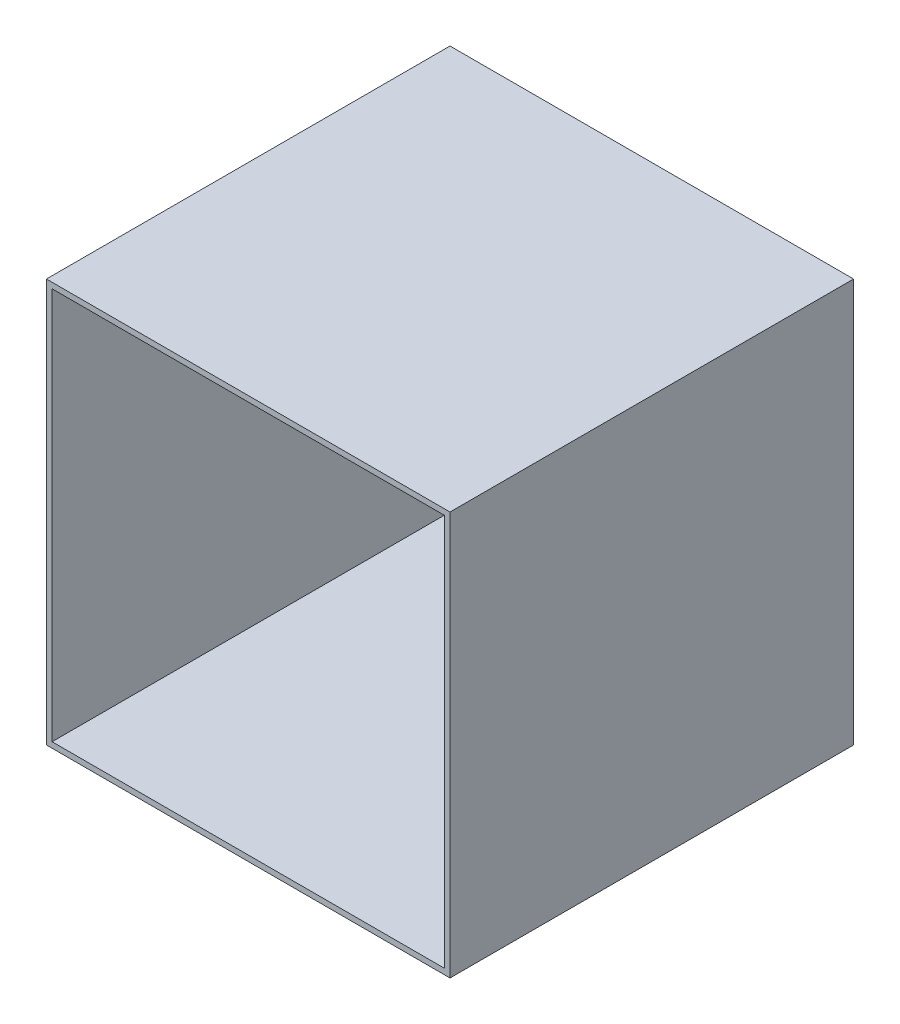
ISO-10303-21;
HEADER;
FILE_DESCRIPTION(('STEP AP214'),'2;1');
FILE_NAME('part.step','',(''),(''),'','','');
FILE_SCHEMA(('AUTOMOTIVE_DESIGN { 1 0 10303 214 1 1 1 1 }'));
ENDSEC;
DATA;
#1=APPLICATION_CONTEXT('core data for automotive mechanical design processes');
#2=APPLICATION_PROTOCOL_DEFINITION('international standard','automotive_design',2000,#1);
#3=PRODUCT_CONTEXT('',#1,'mechanical');
#4=PRODUCT('Part','Part','',(#3));
#5=PRODUCT_RELATED_PRODUCT_CATEGORY('part','',(#4));
#6=PRODUCT_DEFINITION_FORMATION('','',#4);
#7=PRODUCT_DEFINITION_CONTEXT('part definition',#1,'design');
#8=PRODUCT_DEFINITION('design','',#6,#7);
#9=PRODUCT_DEFINITION_SHAPE('','',#8);
#10=(LENGTH_UNIT() NAMED_UNIT(*) SI_UNIT(.MILLI.,.METRE.));
#11=(NAMED_UNIT(*) PLANE_ANGLE_UNIT() SI_UNIT($,.RADIAN.));
#12=(NAMED_UNIT(*) SI_UNIT($,.STERADIAN.) SOLID_ANGLE_UNIT());
#13=UNCERTAINTY_MEASURE_WITH_UNIT(LENGTH_MEASURE(1.E-05),#10,'distance_accuracy_value','');
#14=(GEOMETRIC_REPRESENTATION_CONTEXT(3) GLOBAL_UNCERTAINTY_ASSIGNED_CONTEXT((#13)) GLOBAL_UNIT_ASSIGNED_CONTEXT((#10,
#11,#12)) REPRESENTATION_CONTEXT('',''));
#15=CARTESIAN_POINT('',(0.,0.,0.));
#16=DIRECTION('',(0.,0.,1.));
#17=DIRECTION('',(1.,0.,0.));
#18=AXIS2_PLACEMENT_3D('',#15,#16,#17);
#19=CARTESIAN_POINT('',(0.,0.,25.));
#20=DIRECTION('',(0.,0.,1.));
#21=DIRECTION('',(1.,0.,0.));
#22=AXIS2_PLACEMENT_3D('',#19,#20,#21);
#23=PLANE('',#22);
#24=DIRECTION('',(0.,1.,0.));
#25=VECTOR('',#24,1.);
#26=CARTESIAN_POINT('',(12.5,12.5,25.));
#27=LINE('',#26,#25);
#28=CARTESIAN_POINT('',(12.5,-12.5,25.));
#29=VERTEX_POINT('',#28);
#30=CARTESIAN_POINT('',(12.5,12.5,25.));
#31=VERTEX_POINT('',#30);
#32=EDGE_CURVE('E134',#29,#31,#27,.T.);
#33=ORIENTED_EDGE('',*,*,#32,.T.);
#34=DIRECTION('',(-1.,0.,0.));
#35=VECTOR('',#34,1.);
#36=CARTESIAN_POINT('',(-12.5,12.5,25.));
#37=LINE('',#36,#35);
#38=CARTESIAN_POINT('',(-12.5,12.5,25.));
#39=VERTEX_POINT('',#38);
#40=EDGE_CURVE('E137',#31,#39,#37,.T.);
#41=ORIENTED_EDGE('',*,*,#40,.T.);
#42=DIRECTION('',(0.,-1.,0.));
#43=VECTOR('',#42,1.);
#44=CARTESIAN_POINT('',(-12.5,12.5,25.));
#45=LINE('',#44,#43);
#46=CARTESIAN_POINT('',(-12.5,-12.5,25.));
#47=VERTEX_POINT('',#46);
#48=EDGE_CURVE('E140',#39,#47,#45,.T.);
#49=ORIENTED_EDGE('',*,*,#48,.T.);
#50=DIRECTION('',(1.,0.,0.));
#51=VECTOR('',#50,1.);
#52=CARTESIAN_POINT('',(-12.5,-12.5,25.));
#53=LINE('',#52,#51);
#54=EDGE_CURVE('E142',#47,#29,#53,.T.);
#55=ORIENTED_EDGE('',*,*,#54,.T.);
#56=EDGE_LOOP('',(#33,#41,#49,#55));
#57=FACE_BOUND('',#56,.T.);
#58=DIRECTION('',(-1.,0.,0.));
#59=VECTOR('',#58,1.);
#60=CARTESIAN_POINT('',(-12.15,12.15,25.));
#61=LINE('',#60,#59);
#62=CARTESIAN_POINT('',(12.15,12.15,25.));
#63=VERTEX_POINT('',#62);
#64=CARTESIAN_POINT('',(-12.15,12.15,25.));
#65=VERTEX_POINT('',#64);
#66=EDGE_CURVE('E106',#63,#65,#61,.T.);
#67=ORIENTED_EDGE('',*,*,#66,.F.);
#68=DIRECTION('',(0.,1.,0.));
#69=VECTOR('',#68,1.);
#70=CARTESIAN_POINT('',(12.15,12.15,25.));
#71=LINE('',#70,#69);
#72=CARTESIAN_POINT('',(12.15,-12.15,25.));
#73=VERTEX_POINT('',#72);
#74=EDGE_CURVE('E98',#73,#63,#71,.T.);
#75=ORIENTED_EDGE('',*,*,#74,.F.);
#76=DIRECTION('',(1.,0.,0.));
#77=VECTOR('',#76,1.);
#78=CARTESIAN_POINT('',(-12.15,-12.15,25.));
#79=LINE('',#78,#77);
#80=CARTESIAN_POINT('',(-12.15,-12.15,25.));
#81=VERTEX_POINT('',#80);
#82=EDGE_CURVE('E120',#81,#73,#79,.T.);
#83=ORIENTED_EDGE('',*,*,#82,.F.);
#84=DIRECTION('',(0.,-1.,0.));
#85=VECTOR('',#84,1.);
#86=CARTESIAN_POINT('',(-12.15,12.15,25.));
#87=LINE('',#86,#85);
#88=EDGE_CURVE('E118',#65,#81,#87,.T.);
#89=ORIENTED_EDGE('',*,*,#88,.F.);
#90=EDGE_LOOP('',(#67,#75,#83,#89));
#91=FACE_BOUND('',#90,.T.);
#92=ADVANCED_FACE('F33',(#57,#91),#23,.T.);
#93=CARTESIAN_POINT('',(0.,0.,0.));
#94=DIRECTION('',(0.,0.,1.));
#95=DIRECTION('',(1.,0.,0.));
#96=AXIS2_PLACEMENT_3D('',#93,#94,#95);
#97=PLANE('',#96);
#98=DIRECTION('',(0.,1.,0.));
#99=VECTOR('',#98,1.);
#100=CARTESIAN_POINT('',(12.5,12.5,0.));
#101=LINE('',#100,#99);
#102=CARTESIAN_POINT('',(12.5,-12.5,0.));
#103=VERTEX_POINT('',#102);
#104=CARTESIAN_POINT('',(12.5,12.5,0.));
#105=VERTEX_POINT('',#104);
#106=EDGE_CURVE('E114',#103,#105,#101,.T.);
#107=ORIENTED_EDGE('',*,*,#106,.F.);
#108=DIRECTION('',(1.,0.,0.));
#109=VECTOR('',#108,1.);
#110=CARTESIAN_POINT('',(-12.5,-12.5,0.));
#111=LINE('',#110,#109);
#112=CARTESIAN_POINT('',(-12.5,-12.5,0.));
#113=VERTEX_POINT('',#112);
#114=EDGE_CURVE('E138',#113,#103,#111,.T.);
#115=ORIENTED_EDGE('',*,*,#114,.F.);
#116=DIRECTION('',(0.,-1.,0.));
#117=VECTOR('',#116,1.);
#118=CARTESIAN_POINT('',(-12.5,12.5,0.));
#119=LINE('',#118,#117);
#120=CARTESIAN_POINT('',(-12.5,12.5,0.));
#121=VERTEX_POINT('',#120);
#122=EDGE_CURVE('E149',#121,#113,#119,.T.);
#123=ORIENTED_EDGE('',*,*,#122,.F.);
#124=DIRECTION('',(-1.,0.,0.));
#125=VECTOR('',#124,1.);
#126=CARTESIAN_POINT('',(-12.5,12.5,0.));
#127=LINE('',#126,#125);
#128=EDGE_CURVE('E147',#105,#121,#127,.T.);
#129=ORIENTED_EDGE('',*,*,#128,.F.);
#130=EDGE_LOOP('',(#107,#115,#123,#129));
#131=FACE_BOUND('',#130,.T.);
#132=DIRECTION('',(0.,1.,0.));
#133=VECTOR('',#132,1.);
#134=CARTESIAN_POINT('',(12.15,12.15,0.));
#135=LINE('',#134,#133);
#136=CARTESIAN_POINT('',(12.15,-12.15,0.));
#137=VERTEX_POINT('',#136);
#138=CARTESIAN_POINT('',(12.15,12.15,0.));
#139=VERTEX_POINT('',#138);
#140=EDGE_CURVE('E56',#137,#139,#135,.T.);
#141=ORIENTED_EDGE('',*,*,#140,.T.);
#142=DIRECTION('',(-1.,0.,0.));
#143=VECTOR('',#142,1.);
#144=CARTESIAN_POINT('',(-12.15,12.15,0.));
#145=LINE('',#144,#143);
#146=CARTESIAN_POINT('',(-12.15,12.15,0.));
#147=VERTEX_POINT('',#146);
#148=EDGE_CURVE('E113',#139,#147,#145,.T.);
#149=ORIENTED_EDGE('',*,*,#148,.T.);
#150=DIRECTION('',(0.,-1.,0.));
#151=VECTOR('',#150,1.);
#152=CARTESIAN_POINT('',(-12.15,12.15,0.));
#153=LINE('',#152,#151);
#154=CARTESIAN_POINT('',(-12.15,-12.15,0.));
#155=VERTEX_POINT('',#154);
#156=EDGE_CURVE('E126',#147,#155,#153,.T.);
#157=ORIENTED_EDGE('',*,*,#156,.T.);
#158=DIRECTION('',(1.,0.,0.));
#159=VECTOR('',#158,1.);
#160=CARTESIAN_POINT('',(-12.15,-12.15,0.));
#161=LINE('',#160,#159);
#162=EDGE_CURVE('E107',#155,#137,#161,.T.);
#163=ORIENTED_EDGE('',*,*,#162,.T.);
#164=EDGE_LOOP('',(#141,#149,#157,#163));
#165=FACE_BOUND('',#164,.T.);
#166=ADVANCED_FACE('F167',(#131,#165),#97,.F.);
#167=CARTESIAN_POINT('',(12.5,12.5,25.));
#168=DIRECTION('',(-1.,0.,0.));
#169=DIRECTION('',(0.,-1.,0.));
#170=AXIS2_PLACEMENT_3D('',#167,#168,#169);
#171=PLANE('',#170);
#172=ORIENTED_EDGE('',*,*,#106,.T.);
#173=DIRECTION('',(0.,0.,-1.));
#174=VECTOR('',#173,1.);
#175=CARTESIAN_POINT('',(12.5,12.5,25.));
#176=LINE('',#175,#174);
#177=EDGE_CURVE('E11',#31,#105,#176,.T.);
#178=ORIENTED_EDGE('',*,*,#177,.F.);
#179=ORIENTED_EDGE('',*,*,#32,.F.);
#180=DIRECTION('',(0.,0.,-1.));
#181=VECTOR('',#180,1.);
#182=CARTESIAN_POINT('',(12.5,-12.5,25.));
#183=LINE('',#182,#181);
#184=EDGE_CURVE('E144',#29,#103,#183,.T.);
#185=ORIENTED_EDGE('',*,*,#184,.T.);
#186=EDGE_LOOP('',(#172,#178,#179,#185));
#187=FACE_BOUND('',#186,.T.);
#188=ADVANCED_FACE('F35',(#187),#171,.F.);
#189=CARTESIAN_POINT('',(-12.5,12.5,25.));
#190=DIRECTION('',(0.,-1.,0.));
#191=DIRECTION('',(0.,0.,-1.));
#192=AXIS2_PLACEMENT_3D('',#189,#190,#191);
#193=PLANE('',#192);
#194=ORIENTED_EDGE('',*,*,#128,.T.);
#195=DIRECTION('',(0.,0.,-1.));
#196=VECTOR('',#195,1.);
#197=CARTESIAN_POINT('',(-12.5,12.5,25.));
#198=LINE('',#197,#196);
#199=EDGE_CURVE('E41',#39,#121,#198,.T.);
#200=ORIENTED_EDGE('',*,*,#199,.F.);
#201=ORIENTED_EDGE('',*,*,#40,.F.);
#202=ORIENTED_EDGE('',*,*,#177,.T.);
#203=EDGE_LOOP('',(#194,#200,#201,#202));
#204=FACE_BOUND('',#203,.T.);
#205=ADVANCED_FACE('F177',(#204),#193,.F.);
#206=CARTESIAN_POINT('',(-12.5,12.5,25.));
#207=DIRECTION('',(1.,0.,0.));
#208=DIRECTION('',(0.,1.,0.));
#209=AXIS2_PLACEMENT_3D('',#206,#207,#208);
#210=PLANE('',#209);
#211=ORIENTED_EDGE('',*,*,#122,.T.);
#212=DIRECTION('',(0.,0.,-1.));
#213=VECTOR('',#212,1.);
#214=CARTESIAN_POINT('',(-12.5,-12.5,25.));
#215=LINE('',#214,#213);
#216=EDGE_CURVE('E154',#47,#113,#215,.T.);
#217=ORIENTED_EDGE('',*,*,#216,.F.);
#218=ORIENTED_EDGE('',*,*,#48,.F.);
#219=ORIENTED_EDGE('',*,*,#199,.T.);
#220=EDGE_LOOP('',(#211,#217,#218,#219));
#221=FACE_BOUND('',#220,.T.);
#222=ADVANCED_FACE('F161',(#221),#210,.F.);
#223=CARTESIAN_POINT('',(-12.5,-12.5,25.));
#224=DIRECTION('',(0.,1.,0.));
#225=DIRECTION('',(0.,0.,1.));
#226=AXIS2_PLACEMENT_3D('',#223,#224,#225);
#227=PLANE('',#226);
#228=ORIENTED_EDGE('',*,*,#114,.T.);
#229=ORIENTED_EDGE('',*,*,#184,.F.);
#230=ORIENTED_EDGE('',*,*,#54,.F.);
#231=ORIENTED_EDGE('',*,*,#216,.T.);
#232=EDGE_LOOP('',(#228,#229,#230,#231));
#233=FACE_BOUND('',#232,.T.);
#234=ADVANCED_FACE('F171',(#233),#227,.F.);
#235=CARTESIAN_POINT('',(12.15,12.15,25.));
#236=DIRECTION('',(-1.,0.,0.));
#237=DIRECTION('',(0.,-1.,0.));
#238=AXIS2_PLACEMENT_3D('',#235,#236,#237);
#239=PLANE('',#238);
#240=ORIENTED_EDGE('',*,*,#140,.F.);
#241=DIRECTION('',(0.,0.,-1.));
#242=VECTOR('',#241,1.);
#243=CARTESIAN_POINT('',(12.15,-12.15,25.));
#244=LINE('',#243,#242);
#245=EDGE_CURVE('E102',#73,#137,#244,.T.);
#246=ORIENTED_EDGE('',*,*,#245,.F.);
#247=ORIENTED_EDGE('',*,*,#74,.T.);
#248=DIRECTION('',(0.,0.,-1.));
#249=VECTOR('',#248,1.);
#250=CARTESIAN_POINT('',(12.15,12.15,25.));
#251=LINE('',#250,#249);
#252=EDGE_CURVE('E101',#63,#139,#251,.T.);
#253=ORIENTED_EDGE('',*,*,#252,.T.);
#254=EDGE_LOOP('',(#240,#246,#247,#253));
#255=FACE_BOUND('',#254,.T.);
#256=ADVANCED_FACE('F100',(#255),#239,.T.);
#257=CARTESIAN_POINT('',(-12.15,12.15,25.));
#258=DIRECTION('',(0.,-1.,0.));
#259=DIRECTION('',(0.,0.,-1.));
#260=AXIS2_PLACEMENT_3D('',#257,#258,#259);
#261=PLANE('',#260);
#262=ORIENTED_EDGE('',*,*,#148,.F.);
#263=ORIENTED_EDGE('',*,*,#252,.F.);
#264=ORIENTED_EDGE('',*,*,#66,.T.);
#265=DIRECTION('',(0.,0.,-1.));
#266=VECTOR('',#265,1.);
#267=CARTESIAN_POINT('',(-12.15,12.15,25.));
#268=LINE('',#267,#266);
#269=EDGE_CURVE('E115',#65,#147,#268,.T.);
#270=ORIENTED_EDGE('',*,*,#269,.T.);
#271=EDGE_LOOP('',(#262,#263,#264,#270));
#272=FACE_BOUND('',#271,.T.);
#273=ADVANCED_FACE('F110',(#272),#261,.T.);
#274=CARTESIAN_POINT('',(-12.15,12.15,25.));
#275=DIRECTION('',(1.,0.,0.));
#276=DIRECTION('',(0.,1.,0.));
#277=AXIS2_PLACEMENT_3D('',#274,#275,#276);
#278=PLANE('',#277);
#279=ORIENTED_EDGE('',*,*,#156,.F.);
#280=ORIENTED_EDGE('',*,*,#269,.F.);
#281=ORIENTED_EDGE('',*,*,#88,.T.);
#282=DIRECTION('',(0.,0.,-1.));
#283=VECTOR('',#282,1.);
#284=CARTESIAN_POINT('',(-12.15,-12.15,25.));
#285=LINE('',#284,#283);
#286=EDGE_CURVE('E48',#81,#155,#285,.T.);
#287=ORIENTED_EDGE('',*,*,#286,.T.);
#288=EDGE_LOOP('',(#279,#280,#281,#287));
#289=FACE_BOUND('',#288,.T.);
#290=ADVANCED_FACE('F200',(#289),#278,.T.);
#291=CARTESIAN_POINT('',(-12.15,-12.15,25.));
#292=DIRECTION('',(0.,1.,0.));
#293=DIRECTION('',(0.,0.,1.));
#294=AXIS2_PLACEMENT_3D('',#291,#292,#293);
#295=PLANE('',#294);
#296=ORIENTED_EDGE('',*,*,#162,.F.);
#297=ORIENTED_EDGE('',*,*,#286,.F.);
#298=ORIENTED_EDGE('',*,*,#82,.T.);
#299=ORIENTED_EDGE('',*,*,#245,.T.);
#300=EDGE_LOOP('',(#296,#297,#298,#299));
#301=FACE_BOUND('',#300,.T.);
#302=ADVANCED_FACE('F204',(#301),#295,.T.);
#303=CLOSED_SHELL('',(#92,#166,#188,#205,#222,#234,#256,#273,#290,#302));
#304=MANIFOLD_SOLID_BREP('B2',#303);
#305=ADVANCED_BREP_SHAPE_REPRESENTATION('',(#18,#304),#14);
#306=SHAPE_DEFINITION_REPRESENTATION(#9,#305);
ENDSEC;
END-ISO-10303-21;
